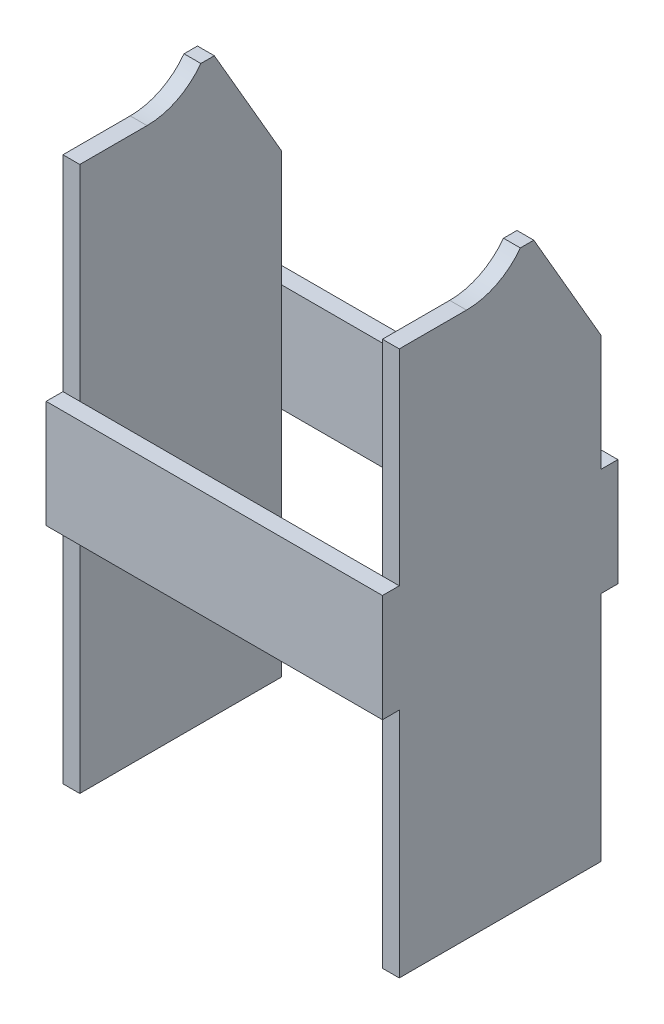
ISO-10303-21;
HEADER;
FILE_DESCRIPTION(('STEP AP214'),'2;1');
FILE_NAME('part.step','',(''),(''),'','','');
FILE_SCHEMA(('AUTOMOTIVE_DESIGN { 1 0 10303 214 1 1 1 1 }'));
ENDSEC;
DATA;
#1=APPLICATION_CONTEXT('core data for automotive mechanical design processes');
#2=APPLICATION_PROTOCOL_DEFINITION('international standard','automotive_design',2000,#1);
#3=PRODUCT_CONTEXT('',#1,'mechanical');
#4=PRODUCT('Part','Part','',(#3));
#5=PRODUCT_RELATED_PRODUCT_CATEGORY('part','',(#4));
#6=PRODUCT_DEFINITION_FORMATION('','',#4);
#7=PRODUCT_DEFINITION_CONTEXT('part definition',#1,'design');
#8=PRODUCT_DEFINITION('design','',#6,#7);
#9=PRODUCT_DEFINITION_SHAPE('','',#8);
#10=(LENGTH_UNIT() NAMED_UNIT(*) SI_UNIT(.MILLI.,.METRE.));
#11=(NAMED_UNIT(*) PLANE_ANGLE_UNIT() SI_UNIT($,.RADIAN.));
#12=(NAMED_UNIT(*) SI_UNIT($,.STERADIAN.) SOLID_ANGLE_UNIT());
#13=UNCERTAINTY_MEASURE_WITH_UNIT(LENGTH_MEASURE(1.E-05),#10,'distance_accuracy_value','');
#14=(GEOMETRIC_REPRESENTATION_CONTEXT(3) GLOBAL_UNCERTAINTY_ASSIGNED_CONTEXT((#13)) GLOBAL_UNIT_ASSIGNED_CONTEXT((#10,
#11,#12)) REPRESENTATION_CONTEXT('',''));
#15=CARTESIAN_POINT('',(0.,0.,0.));
#16=DIRECTION('',(0.,0.,1.));
#17=DIRECTION('',(1.,0.,0.));
#18=AXIS2_PLACEMENT_3D('',#15,#16,#17);
#19=CARTESIAN_POINT('',(-50.,170.,-30.));
#20=DIRECTION('',(0.,0.,1.));
#21=DIRECTION('',(1.,0.,0.));
#22=AXIS2_PLACEMENT_3D('',#19,#20,#21);
#23=PLANE('',#22);
#24=DIRECTION('',(0.,-1.,0.));
#25=VECTOR('',#24,1.);
#26=CARTESIAN_POINT('',(-50.,170.,-30.));
#27=LINE('',#26,#25);
#28=CARTESIAN_POINT('',(-50.,135.5,-30.));
#29=VERTEX_POINT('',#28);
#30=CARTESIAN_POINT('',(-50.,101.,-30.));
#31=VERTEX_POINT('',#30);
#32=EDGE_CURVE('E440',#29,#31,#27,.T.);
#33=ORIENTED_EDGE('',*,*,#32,.F.);
#34=DIRECTION('',(-1.,0.,0.));
#35=VECTOR('',#34,1.);
#36=CARTESIAN_POINT('',(70.,135.5,-30.));
#37=LINE('',#36,#35);
#38=CARTESIAN_POINT('',(-45.,135.5,-30.));
#39=VERTEX_POINT('',#38);
#40=EDGE_CURVE('E243',#39,#29,#37,.T.);
#41=ORIENTED_EDGE('',*,*,#40,.F.);
#42=DIRECTION('',(0.,-1.,0.));
#43=VECTOR('',#42,1.);
#44=CARTESIAN_POINT('',(-45.,170.,-30.));
#45=LINE('',#44,#43);
#46=CARTESIAN_POINT('',(-45.,101.,-30.));
#47=VERTEX_POINT('',#46);
#48=EDGE_CURVE('E444',#39,#47,#45,.T.);
#49=ORIENTED_EDGE('',*,*,#48,.T.);
#50=DIRECTION('',(1.,0.,0.));
#51=VECTOR('',#50,1.);
#52=CARTESIAN_POINT('',(-50.,101.,-30.));
#53=LINE('',#52,#51);
#54=EDGE_CURVE('E309',#31,#47,#53,.T.);
#55=ORIENTED_EDGE('',*,*,#54,.F.);
#56=EDGE_LOOP('',(#33,#41,#49,#55));
#57=FACE_BOUND('',#56,.T.);
#58=ADVANCED_FACE('F39',(#57),#23,.F.);
#59=CARTESIAN_POINT('',(45.,170.,-30.));
#60=DIRECTION('',(0.,0.,1.));
#61=DIRECTION('',(1.,0.,0.));
#62=AXIS2_PLACEMENT_3D('',#59,#60,#61);
#63=PLANE('',#62);
#64=DIRECTION('',(0.,-1.,0.));
#65=VECTOR('',#64,1.);
#66=CARTESIAN_POINT('',(45.,170.,-30.));
#67=LINE('',#66,#65);
#68=CARTESIAN_POINT('',(45.,135.5,-30.));
#69=VERTEX_POINT('',#68);
#70=CARTESIAN_POINT('',(45.,101.,-30.));
#71=VERTEX_POINT('',#70);
#72=EDGE_CURVE('E352',#69,#71,#67,.T.);
#73=ORIENTED_EDGE('',*,*,#72,.F.);
#74=CARTESIAN_POINT('',(50.,135.5,-30.));
#75=VERTEX_POINT('',#74);
#76=EDGE_CURVE('E248',#75,#69,#37,.T.);
#77=ORIENTED_EDGE('',*,*,#76,.F.);
#78=DIRECTION('',(0.,-1.,0.));
#79=VECTOR('',#78,1.);
#80=CARTESIAN_POINT('',(50.,170.,-30.));
#81=LINE('',#80,#79);
#82=CARTESIAN_POINT('',(50.,101.,-30.));
#83=VERTEX_POINT('',#82);
#84=EDGE_CURVE('E357',#75,#83,#81,.T.);
#85=ORIENTED_EDGE('',*,*,#84,.T.);
#86=EDGE_CURVE('E315',#71,#83,#53,.T.);
#87=ORIENTED_EDGE('',*,*,#86,.F.);
#88=EDGE_LOOP('',(#73,#77,#85,#87));
#89=FACE_BOUND('',#88,.T.);
#90=ADVANCED_FACE('F475',(#89),#63,.F.);
#91=CARTESIAN_POINT('',(-50.,101.,30.));
#92=DIRECTION('',(0.,0.,-1.));
#93=DIRECTION('',(-1.,0.,0.));
#94=AXIS2_PLACEMENT_3D('',#91,#92,#93);
#95=PLANE('',#94);
#96=DIRECTION('',(1.,0.,0.));
#97=VECTOR('',#96,1.);
#98=CARTESIAN_POINT('',(-50.,101.,30.));
#99=LINE('',#98,#97);
#100=CARTESIAN_POINT('',(-45.,101.,30.));
#101=VERTEX_POINT('',#100);
#102=CARTESIAN_POINT('',(45.,101.,30.));
#103=VERTEX_POINT('',#102);
#104=EDGE_CURVE('E390',#101,#103,#99,.T.);
#105=ORIENTED_EDGE('',*,*,#104,.T.);
#106=DIRECTION('',(0.,-1.,0.));
#107=VECTOR('',#106,1.);
#108=CARTESIAN_POINT('',(45.,170.,30.));
#109=LINE('',#108,#107);
#110=CARTESIAN_POINT('',(45.,69.,30.));
#111=VERTEX_POINT('',#110);
#112=EDGE_CURVE('E369',#103,#111,#109,.T.);
#113=ORIENTED_EDGE('',*,*,#112,.T.);
#114=DIRECTION('',(1.,0.,0.));
#115=VECTOR('',#114,1.);
#116=CARTESIAN_POINT('',(-50.,69.,30.));
#117=LINE('',#116,#115);
#118=CARTESIAN_POINT('',(-45.,69.,30.));
#119=VERTEX_POINT('',#118);
#120=EDGE_CURVE('E406',#119,#111,#117,.T.);
#121=ORIENTED_EDGE('',*,*,#120,.F.);
#122=DIRECTION('',(0.,-1.,0.));
#123=VECTOR('',#122,1.);
#124=CARTESIAN_POINT('',(-45.,170.,30.));
#125=LINE('',#124,#123);
#126=EDGE_CURVE('E452',#101,#119,#125,.T.);
#127=ORIENTED_EDGE('',*,*,#126,.F.);
#128=EDGE_LOOP('',(#105,#113,#121,#127));
#129=FACE_BOUND('',#128,.T.);
#130=ADVANCED_FACE('F542',(#129),#95,.T.);
#131=CARTESIAN_POINT('',(-50.,170.,30.));
#132=DIRECTION('',(0.,0.,-1.));
#133=DIRECTION('',(-1.,0.,0.));
#134=AXIS2_PLACEMENT_3D('',#131,#132,#133);
#135=PLANE('',#134);
#136=CARTESIAN_POINT('',(-50.,69.,30.));
#137=VERTEX_POINT('',#136);
#138=EDGE_CURVE('E401',#137,#119,#117,.T.);
#139=ORIENTED_EDGE('',*,*,#138,.F.);
#140=DIRECTION('',(0.,-1.,0.));
#141=VECTOR('',#140,1.);
#142=CARTESIAN_POINT('',(-50.,170.,30.));
#143=LINE('',#142,#141);
#144=CARTESIAN_POINT('',(-50.,0.,30.));
#145=VERTEX_POINT('',#144);
#146=EDGE_CURVE('E451',#137,#145,#143,.T.);
#147=ORIENTED_EDGE('',*,*,#146,.T.);
#148=DIRECTION('',(1.,0.,0.));
#149=VECTOR('',#148,1.);
#150=CARTESIAN_POINT('',(-50.,0.,30.));
#151=LINE('',#150,#149);
#152=CARTESIAN_POINT('',(-45.,0.,30.));
#153=VERTEX_POINT('',#152);
#154=EDGE_CURVE('E429',#145,#153,#151,.T.);
#155=ORIENTED_EDGE('',*,*,#154,.T.);
#156=EDGE_CURVE('E447',#119,#153,#125,.T.);
#157=ORIENTED_EDGE('',*,*,#156,.F.);
#158=EDGE_LOOP('',(#139,#147,#155,#157));
#159=FACE_BOUND('',#158,.T.);
#160=ADVANCED_FACE('F550',(#159),#135,.F.);
#161=CARTESIAN_POINT('',(-50.,170.,-30.));
#162=DIRECTION('',(1.,0.,0.));
#163=DIRECTION('',(0.,0.,-1.));
#164=AXIS2_PLACEMENT_3D('',#161,#162,#163);
#165=PLANE('',#164);
#166=DIRECTION('',(0.,0.,1.));
#167=VECTOR('',#166,1.);
#168=CARTESIAN_POINT('',(-50.,162.,10.));
#169=LINE('',#168,#167);
#170=CARTESIAN_POINT('',(-50.,162.,10.));
#171=VERTEX_POINT('',#170);
#172=CARTESIAN_POINT('',(-50.,162.,30.));
#173=VERTEX_POINT('',#172);
#174=EDGE_CURVE('E215',#171,#173,#169,.T.);
#175=ORIENTED_EDGE('',*,*,#174,.F.);
#176=CARTESIAN_POINT('',(-50.,182.,10.));
#177=DIRECTION('',(-1.,0.,0.));
#178=DIRECTION('',(0.,0.,1.));
#179=AXIS2_PLACEMENT_3D('',#176,#177,#178);
#180=CIRCLE('',#179,20.);
#181=CARTESIAN_POINT('',(-50.,170.,-5.99999999999996));
#182=VERTEX_POINT('',#181);
#183=EDGE_CURVE('E223',#182,#171,#180,.T.);
#184=ORIENTED_EDGE('',*,*,#183,.F.);
#185=DIRECTION('',(0.,0.,1.));
#186=VECTOR('',#185,1.);
#187=CARTESIAN_POINT('',(-50.,170.,-30.));
#188=LINE('',#187,#186);
#189=CARTESIAN_POINT('',(-50.,170.,-9.99999999999997));
#190=VERTEX_POINT('',#189);
#191=EDGE_CURVE('E417',#190,#182,#188,.T.);
#192=ORIENTED_EDGE('',*,*,#191,.F.);
#193=DIRECTION('',(0.,0.865140001465014,0.501530435631892));
#194=VECTOR('',#193,1.);
#195=CARTESIAN_POINT('',(-50.,170.,-9.99999999999997));
#196=LINE('',#195,#194);
#197=EDGE_CURVE('E63',#29,#190,#196,.T.);
#198=ORIENTED_EDGE('',*,*,#197,.F.);
#199=ORIENTED_EDGE('',*,*,#32,.T.);
#200=DIRECTION('',(0.,0.,1.));
#201=VECTOR('',#200,1.);
#202=CARTESIAN_POINT('',(-50.,101.,-30.));
#203=LINE('',#202,#201);
#204=CARTESIAN_POINT('',(-50.,101.,-35.));
#205=VERTEX_POINT('',#204);
#206=EDGE_CURVE('E294',#205,#31,#203,.T.);
#207=ORIENTED_EDGE('',*,*,#206,.F.);
#208=DIRECTION('',(0.,1.,0.));
#209=VECTOR('',#208,1.);
#210=CARTESIAN_POINT('',(-50.,101.,-35.));
#211=LINE('',#210,#209);
#212=CARTESIAN_POINT('',(-50.,69.,-35.));
#213=VERTEX_POINT('',#212);
#214=EDGE_CURVE('E289',#213,#205,#211,.T.);
#215=ORIENTED_EDGE('',*,*,#214,.F.);
#216=DIRECTION('',(0.,0.,-1.));
#217=VECTOR('',#216,1.);
#218=CARTESIAN_POINT('',(-50.,69.,-30.));
#219=LINE('',#218,#217);
#220=CARTESIAN_POINT('',(-50.,69.,-30.));
#221=VERTEX_POINT('',#220);
#222=EDGE_CURVE('E285',#221,#213,#219,.T.);
#223=ORIENTED_EDGE('',*,*,#222,.F.);
#224=CARTESIAN_POINT('',(-50.,0.,-30.));
#225=VERTEX_POINT('',#224);
#226=EDGE_CURVE('E425',#221,#225,#27,.T.);
#227=ORIENTED_EDGE('',*,*,#226,.T.);
#228=DIRECTION('',(0.,0.,1.));
#229=VECTOR('',#228,1.);
#230=CARTESIAN_POINT('',(-50.,0.,-30.));
#231=LINE('',#230,#229);
#232=EDGE_CURVE('E405',#225,#145,#231,.T.);
#233=ORIENTED_EDGE('',*,*,#232,.T.);
#234=ORIENTED_EDGE('',*,*,#146,.F.);
#235=DIRECTION('',(0.,0.,-1.));
#236=VECTOR('',#235,1.);
#237=CARTESIAN_POINT('',(-50.,69.,30.));
#238=LINE('',#237,#236);
#239=CARTESIAN_POINT('',(-50.,69.,35.));
#240=VERTEX_POINT('',#239);
#241=EDGE_CURVE('E387',#240,#137,#238,.T.);
#242=ORIENTED_EDGE('',*,*,#241,.F.);
#243=DIRECTION('',(0.,-1.,0.));
#244=VECTOR('',#243,1.);
#245=CARTESIAN_POINT('',(-50.,101.,35.));
#246=LINE('',#245,#244);
#247=CARTESIAN_POINT('',(-50.,101.,35.));
#248=VERTEX_POINT('',#247);
#249=EDGE_CURVE('E382',#248,#240,#246,.T.);
#250=ORIENTED_EDGE('',*,*,#249,.F.);
#251=DIRECTION('',(0.,0.,1.));
#252=VECTOR('',#251,1.);
#253=CARTESIAN_POINT('',(-50.,101.,30.));
#254=LINE('',#253,#252);
#255=CARTESIAN_POINT('',(-50.,101.,30.));
#256=VERTEX_POINT('',#255);
#257=EDGE_CURVE('E378',#256,#248,#254,.T.);
#258=ORIENTED_EDGE('',*,*,#257,.F.);
#259=EDGE_CURVE('E233',#173,#256,#143,.T.);
#260=ORIENTED_EDGE('',*,*,#259,.F.);
#261=EDGE_LOOP('',(#175,#184,#192,#198,#199,#207,#215,#223,#227,#233,#234,#242,#250,#258,#260));
#262=FACE_BOUND('',#261,.T.);
#263=ADVANCED_FACE('F41',(#262),#165,.F.);
#264=CARTESIAN_POINT('',(-45.,162.,30.));
#265=VERTEX_POINT('',#264);
#266=EDGE_CURVE('E448',#265,#101,#125,.T.);
#267=ORIENTED_EDGE('',*,*,#266,.F.);
#268=DIRECTION('',(-1.,0.,0.));
#269=VECTOR('',#268,1.);
#270=CARTESIAN_POINT('',(70.,162.,30.));
#271=LINE('',#270,#269);
#272=EDGE_CURVE('E237',#265,#173,#271,.T.);
#273=ORIENTED_EDGE('',*,*,#272,.T.);
#274=ORIENTED_EDGE('',*,*,#259,.T.);
#275=EDGE_CURVE('E413',#256,#101,#99,.T.);
#276=ORIENTED_EDGE('',*,*,#275,.T.);
#277=EDGE_LOOP('',(#267,#273,#274,#276));
#278=FACE_BOUND('',#277,.T.);
#279=ADVANCED_FACE('F557',(#278),#135,.F.);
#280=CARTESIAN_POINT('',(-45.,170.,-30.));
#281=DIRECTION('',(-1.,0.,0.));
#282=DIRECTION('',(0.,0.,1.));
#283=AXIS2_PLACEMENT_3D('',#280,#281,#282);
#284=PLANE('',#283);
#285=DIRECTION('',(0.,0.,-1.));
#286=VECTOR('',#285,1.);
#287=CARTESIAN_POINT('',(-45.,170.,-30.));
#288=LINE('',#287,#286);
#289=CARTESIAN_POINT('',(-45.,170.,-5.99999999999996));
#290=VERTEX_POINT('',#289);
#291=CARTESIAN_POINT('',(-45.,170.,-9.99999999999997));
#292=VERTEX_POINT('',#291);
#293=EDGE_CURVE('E420',#290,#292,#288,.T.);
#294=ORIENTED_EDGE('',*,*,#293,.F.);
#295=CARTESIAN_POINT('',(-45.,182.,10.));
#296=DIRECTION('',(-1.,0.,0.));
#297=DIRECTION('',(0.,0.,1.));
#298=AXIS2_PLACEMENT_3D('',#295,#296,#297);
#299=CIRCLE('',#298,20.);
#300=CARTESIAN_POINT('',(-45.,162.,10.));
#301=VERTEX_POINT('',#300);
#302=EDGE_CURVE('E55',#290,#301,#299,.T.);
#303=ORIENTED_EDGE('',*,*,#302,.T.);
#304=DIRECTION('',(0.,0.,1.));
#305=VECTOR('',#304,1.);
#306=CARTESIAN_POINT('',(-45.,162.,-30.));
#307=LINE('',#306,#305);
#308=EDGE_CURVE('E218',#301,#265,#307,.T.);
#309=ORIENTED_EDGE('',*,*,#308,.T.);
#310=ORIENTED_EDGE('',*,*,#266,.T.);
#311=ORIENTED_EDGE('',*,*,#126,.T.);
#312=ORIENTED_EDGE('',*,*,#156,.T.);
#313=DIRECTION('',(0.,0.,-1.));
#314=VECTOR('',#313,1.);
#315=CARTESIAN_POINT('',(-45.,0.,-30.));
#316=LINE('',#315,#314);
#317=CARTESIAN_POINT('',(-45.,0.,-30.));
#318=VERTEX_POINT('',#317);
#319=EDGE_CURVE('E433',#153,#318,#316,.T.);
#320=ORIENTED_EDGE('',*,*,#319,.T.);
#321=CARTESIAN_POINT('',(-45.,69.,-30.));
#322=VERTEX_POINT('',#321);
#323=EDGE_CURVE('E443',#322,#318,#45,.T.);
#324=ORIENTED_EDGE('',*,*,#323,.F.);
#325=EDGE_CURVE('E313',#47,#322,#45,.T.);
#326=ORIENTED_EDGE('',*,*,#325,.F.);
#327=ORIENTED_EDGE('',*,*,#48,.F.);
#328=DIRECTION('',(0.,0.865140001465014,0.501530435631893));
#329=VECTOR('',#328,1.);
#330=CARTESIAN_POINT('',(-45.,161.322119163654,-15.0306555573023));
#331=LINE('',#330,#329);
#332=EDGE_CURVE('E258',#39,#292,#331,.T.);
#333=ORIENTED_EDGE('',*,*,#332,.T.);
#334=EDGE_LOOP('',(#294,#303,#309,#310,#311,#312,#320,#324,#326,#327,#333));
#335=FACE_BOUND('',#334,.T.);
#336=ADVANCED_FACE('F493',(#335),#284,.F.);
#337=ORIENTED_EDGE('',*,*,#226,.F.);
#338=DIRECTION('',(1.,0.,0.));
#339=VECTOR('',#338,1.);
#340=CARTESIAN_POINT('',(-50.,69.,-30.));
#341=LINE('',#340,#339);
#342=EDGE_CURVE('E322',#221,#322,#341,.T.);
#343=ORIENTED_EDGE('',*,*,#342,.T.);
#344=ORIENTED_EDGE('',*,*,#323,.T.);
#345=DIRECTION('',(-1.,0.,0.));
#346=VECTOR('',#345,1.);
#347=CARTESIAN_POINT('',(-50.,0.,-30.));
#348=LINE('',#347,#346);
#349=EDGE_CURVE('E421',#318,#225,#348,.T.);
#350=ORIENTED_EDGE('',*,*,#349,.T.);
#351=EDGE_LOOP('',(#337,#343,#344,#350));
#352=FACE_BOUND('',#351,.T.);
#353=ADVANCED_FACE('F500',(#352),#23,.F.);
#354=CARTESIAN_POINT('',(0.,170.,0.));
#355=DIRECTION('',(0.,1.,0.));
#356=DIRECTION('',(0.,0.,1.));
#357=AXIS2_PLACEMENT_3D('',#354,#355,#356);
#358=PLANE('',#357);
#359=DIRECTION('',(-1.,0.,0.));
#360=VECTOR('',#359,1.);
#361=CARTESIAN_POINT('',(70.,170.,-5.99999999999999));
#362=LINE('',#361,#360);
#363=EDGE_CURVE('E225',#290,#182,#362,.T.);
#364=ORIENTED_EDGE('',*,*,#363,.F.);
#365=ORIENTED_EDGE('',*,*,#293,.T.);
#366=DIRECTION('',(-1.,0.,0.));
#367=VECTOR('',#366,1.);
#368=CARTESIAN_POINT('',(70.,170.,-10.));
#369=LINE('',#368,#367);
#370=EDGE_CURVE('E244',#292,#190,#369,.T.);
#371=ORIENTED_EDGE('',*,*,#370,.T.);
#372=ORIENTED_EDGE('',*,*,#191,.T.);
#373=EDGE_LOOP('',(#364,#365,#371,#372));
#374=FACE_BOUND('',#373,.T.);
#375=ADVANCED_FACE('F604',(#374),#358,.T.);
#376=CARTESIAN_POINT('',(0.,0.,0.));
#377=DIRECTION('',(0.,1.,0.));
#378=DIRECTION('',(0.,0.,1.));
#379=AXIS2_PLACEMENT_3D('',#376,#377,#378);
#380=PLANE('',#379);
#381=ORIENTED_EDGE('',*,*,#232,.F.);
#382=ORIENTED_EDGE('',*,*,#349,.F.);
#383=ORIENTED_EDGE('',*,*,#319,.F.);
#384=ORIENTED_EDGE('',*,*,#154,.F.);
#385=EDGE_LOOP('',(#381,#382,#383,#384));
#386=FACE_BOUND('',#385,.T.);
#387=ADVANCED_FACE('F508',(#386),#380,.F.);
#388=CARTESIAN_POINT('',(-50.,69.,30.));
#389=DIRECTION('',(0.,-1.,0.));
#390=DIRECTION('',(0.,0.,-1.));
#391=AXIS2_PLACEMENT_3D('',#388,#389,#390);
#392=PLANE('',#391);
#393=DIRECTION('',(0.,0.,-1.));
#394=VECTOR('',#393,1.);
#395=CARTESIAN_POINT('',(50.,69.,30.));
#396=LINE('',#395,#394);
#397=CARTESIAN_POINT('',(50.,69.,35.));
#398=VERTEX_POINT('',#397);
#399=CARTESIAN_POINT('',(50.,69.,30.));
#400=VERTEX_POINT('',#399);
#401=EDGE_CURVE('E383',#398,#400,#396,.T.);
#402=ORIENTED_EDGE('',*,*,#401,.F.);
#403=DIRECTION('',(1.,0.,0.));
#404=VECTOR('',#403,1.);
#405=CARTESIAN_POINT('',(-50.,69.,35.));
#406=LINE('',#405,#404);
#407=EDGE_CURVE('E407',#240,#398,#406,.T.);
#408=ORIENTED_EDGE('',*,*,#407,.F.);
#409=ORIENTED_EDGE('',*,*,#241,.T.);
#410=ORIENTED_EDGE('',*,*,#138,.T.);
#411=ORIENTED_EDGE('',*,*,#120,.T.);
#412=DIRECTION('',(1.,0.,0.));
#413=VECTOR('',#412,1.);
#414=CARTESIAN_POINT('',(-50.,69.,30.));
#415=LINE('',#414,#413);
#416=EDGE_CURVE('E373',#111,#400,#415,.T.);
#417=ORIENTED_EDGE('',*,*,#416,.T.);
#418=EDGE_LOOP('',(#402,#408,#409,#410,#411,#417));
#419=FACE_BOUND('',#418,.T.);
#420=ADVANCED_FACE('F547',(#419),#392,.T.);
#421=CARTESIAN_POINT('',(-50.,101.,35.));
#422=DIRECTION('',(0.,0.,1.));
#423=DIRECTION('',(0.,-1.,0.));
#424=AXIS2_PLACEMENT_3D('',#421,#422,#423);
#425=PLANE('',#424);
#426=DIRECTION('',(0.,-1.,0.));
#427=VECTOR('',#426,1.);
#428=CARTESIAN_POINT('',(50.,101.,35.));
#429=LINE('',#428,#427);
#430=CARTESIAN_POINT('',(50.,101.,35.));
#431=VERTEX_POINT('',#430);
#432=EDGE_CURVE('E394',#431,#398,#429,.T.);
#433=ORIENTED_EDGE('',*,*,#432,.F.);
#434=DIRECTION('',(1.,0.,0.));
#435=VECTOR('',#434,1.);
#436=CARTESIAN_POINT('',(-50.,101.,35.));
#437=LINE('',#436,#435);
#438=EDGE_CURVE('E410',#248,#431,#437,.T.);
#439=ORIENTED_EDGE('',*,*,#438,.F.);
#440=ORIENTED_EDGE('',*,*,#249,.T.);
#441=ORIENTED_EDGE('',*,*,#407,.T.);
#442=EDGE_LOOP('',(#433,#439,#440,#441));
#443=FACE_BOUND('',#442,.T.);
#444=ADVANCED_FACE('F564',(#443),#425,.T.);
#445=CARTESIAN_POINT('',(-50.,101.,30.));
#446=DIRECTION('',(0.,1.,0.));
#447=DIRECTION('',(0.,0.,1.));
#448=AXIS2_PLACEMENT_3D('',#445,#446,#447);
#449=PLANE('',#448);
#450=DIRECTION('',(0.,0.,1.));
#451=VECTOR('',#450,1.);
#452=CARTESIAN_POINT('',(50.,101.,30.));
#453=LINE('',#452,#451);
#454=CARTESIAN_POINT('',(50.,101.,30.));
#455=VERTEX_POINT('',#454);
#456=EDGE_CURVE('E377',#455,#431,#453,.T.);
#457=ORIENTED_EDGE('',*,*,#456,.F.);
#458=DIRECTION('',(-1.,0.,0.));
#459=VECTOR('',#458,1.);
#460=CARTESIAN_POINT('',(-50.,101.,30.));
#461=LINE('',#460,#459);
#462=EDGE_CURVE('E368',#455,#103,#461,.T.);
#463=ORIENTED_EDGE('',*,*,#462,.T.);
#464=ORIENTED_EDGE('',*,*,#104,.F.);
#465=ORIENTED_EDGE('',*,*,#275,.F.);
#466=ORIENTED_EDGE('',*,*,#257,.T.);
#467=ORIENTED_EDGE('',*,*,#438,.T.);
#468=EDGE_LOOP('',(#457,#463,#464,#465,#466,#467));
#469=FACE_BOUND('',#468,.T.);
#470=ADVANCED_FACE('F560',(#469),#449,.T.);
#471=CARTESIAN_POINT('',(50.,0.,0.));
#472=DIRECTION('',(-1.,0.,0.));
#473=DIRECTION('',(0.,0.,1.));
#474=AXIS2_PLACEMENT_3D('',#471,#472,#473);
#475=PLANE('',#474);
#476=DIRECTION('',(0.,0.,-1.));
#477=VECTOR('',#476,1.);
#478=CARTESIAN_POINT('',(50.,170.,-30.));
#479=LINE('',#478,#477);
#480=CARTESIAN_POINT('',(50.,170.,-5.99999999999998));
#481=VERTEX_POINT('',#480);
#482=CARTESIAN_POINT('',(50.,170.,-9.99999999999999));
#483=VERTEX_POINT('',#482);
#484=EDGE_CURVE('E331',#481,#483,#479,.T.);
#485=ORIENTED_EDGE('',*,*,#484,.F.);
#486=CARTESIAN_POINT('',(50.,182.,9.99999999999999));
#487=DIRECTION('',(-1.,0.,0.));
#488=DIRECTION('',(0.,0.,1.));
#489=AXIS2_PLACEMENT_3D('',#486,#487,#488);
#490=CIRCLE('',#489,20.);
#491=CARTESIAN_POINT('',(50.,162.,9.99999999999999));
#492=VERTEX_POINT('',#491);
#493=EDGE_CURVE('E266',#481,#492,#490,.T.);
#494=ORIENTED_EDGE('',*,*,#493,.T.);
#495=DIRECTION('',(0.,0.,1.));
#496=VECTOR('',#495,1.);
#497=CARTESIAN_POINT('',(50.,162.,0.));
#498=LINE('',#497,#496);
#499=CARTESIAN_POINT('',(50.,162.,30.));
#500=VERTEX_POINT('',#499);
#501=EDGE_CURVE('E278',#492,#500,#498,.T.);
#502=ORIENTED_EDGE('',*,*,#501,.T.);
#503=DIRECTION('',(0.,-1.,0.));
#504=VECTOR('',#503,1.);
#505=CARTESIAN_POINT('',(50.,170.,30.));
#506=LINE('',#505,#504);
#507=EDGE_CURVE('E361',#500,#455,#506,.T.);
#508=ORIENTED_EDGE('',*,*,#507,.T.);
#509=ORIENTED_EDGE('',*,*,#456,.T.);
#510=ORIENTED_EDGE('',*,*,#432,.T.);
#511=ORIENTED_EDGE('',*,*,#401,.T.);
#512=CARTESIAN_POINT('',(50.,0.,30.));
#513=VERTEX_POINT('',#512);
#514=EDGE_CURVE('E360',#400,#513,#506,.T.);
#515=ORIENTED_EDGE('',*,*,#514,.T.);
#516=DIRECTION('',(0.,0.,-1.));
#517=VECTOR('',#516,1.);
#518=CARTESIAN_POINT('',(50.,0.,-30.));
#519=LINE('',#518,#517);
#520=CARTESIAN_POINT('',(50.,0.,-30.));
#521=VERTEX_POINT('',#520);
#522=EDGE_CURVE('E345',#513,#521,#519,.T.);
#523=ORIENTED_EDGE('',*,*,#522,.T.);
#524=CARTESIAN_POINT('',(50.,69.,-30.));
#525=VERTEX_POINT('',#524);
#526=EDGE_CURVE('E355',#525,#521,#81,.T.);
#527=ORIENTED_EDGE('',*,*,#526,.F.);
#528=DIRECTION('',(0.,0.,-1.));
#529=VECTOR('',#528,1.);
#530=CARTESIAN_POINT('',(50.,69.,-30.));
#531=LINE('',#530,#529);
#532=CARTESIAN_POINT('',(50.,69.,-35.));
#533=VERTEX_POINT('',#532);
#534=EDGE_CURVE('E284',#525,#533,#531,.T.);
#535=ORIENTED_EDGE('',*,*,#534,.T.);
#536=DIRECTION('',(0.,1.,0.));
#537=VECTOR('',#536,1.);
#538=CARTESIAN_POINT('',(50.,101.,-35.));
#539=LINE('',#538,#537);
#540=CARTESIAN_POINT('',(50.,101.,-35.));
#541=VERTEX_POINT('',#540);
#542=EDGE_CURVE('E302',#533,#541,#539,.T.);
#543=ORIENTED_EDGE('',*,*,#542,.T.);
#544=DIRECTION('',(0.,0.,1.));
#545=VECTOR('',#544,1.);
#546=CARTESIAN_POINT('',(50.,101.,-30.));
#547=LINE('',#546,#545);
#548=EDGE_CURVE('E290',#541,#83,#547,.T.);
#549=ORIENTED_EDGE('',*,*,#548,.T.);
#550=ORIENTED_EDGE('',*,*,#84,.F.);
#551=DIRECTION('',(0.,0.865140001465014,0.501530435631893));
#552=VECTOR('',#551,1.);
#553=CARTESIAN_POINT('',(50.,47.0995126552429,-81.246659330294));
#554=LINE('',#553,#552);
#555=EDGE_CURVE('E254',#75,#483,#554,.T.);
#556=ORIENTED_EDGE('',*,*,#555,.T.);
#557=EDGE_LOOP('',(#485,#494,#502,#508,#509,#510,#511,#515,#523,#527,#535,#543,#549,#550,#556));
#558=FACE_BOUND('',#557,.T.);
#559=ADVANCED_FACE('F480',(#558),#475,.F.);
#560=CARTESIAN_POINT('',(45.,170.,30.));
#561=DIRECTION('',(0.,0.,-1.));
#562=DIRECTION('',(-1.,0.,0.));
#563=AXIS2_PLACEMENT_3D('',#560,#561,#562);
#564=PLANE('',#563);
#565=ORIENTED_EDGE('',*,*,#416,.F.);
#566=CARTESIAN_POINT('',(45.,0.,30.));
#567=VERTEX_POINT('',#566);
#568=EDGE_CURVE('E364',#111,#567,#109,.T.);
#569=ORIENTED_EDGE('',*,*,#568,.T.);
#570=DIRECTION('',(1.,0.,0.));
#571=VECTOR('',#570,1.);
#572=CARTESIAN_POINT('',(45.,0.,30.));
#573=LINE('',#572,#571);
#574=EDGE_CURVE('E341',#567,#513,#573,.T.);
#575=ORIENTED_EDGE('',*,*,#574,.T.);
#576=ORIENTED_EDGE('',*,*,#514,.F.);
#577=EDGE_LOOP('',(#565,#569,#575,#576));
#578=FACE_BOUND('',#577,.T.);
#579=ADVANCED_FACE('F538',(#578),#564,.F.);
#580=CARTESIAN_POINT('',(45.,170.,-30.));
#581=DIRECTION('',(1.,0.,0.));
#582=DIRECTION('',(0.,0.,-1.));
#583=AXIS2_PLACEMENT_3D('',#580,#581,#582);
#584=PLANE('',#583);
#585=DIRECTION('',(0.,0.,-1.));
#586=VECTOR('',#585,1.);
#587=CARTESIAN_POINT('',(45.,162.,-30.));
#588=LINE('',#587,#586);
#589=CARTESIAN_POINT('',(45.,162.,30.));
#590=VERTEX_POINT('',#589);
#591=CARTESIAN_POINT('',(45.,162.,9.99999999999999));
#592=VERTEX_POINT('',#591);
#593=EDGE_CURVE('E274',#590,#592,#588,.T.);
#594=ORIENTED_EDGE('',*,*,#593,.T.);
#595=CARTESIAN_POINT('',(45.,182.,9.99999999999999));
#596=DIRECTION('',(1.,0.,0.));
#597=DIRECTION('',(0.,0.,-1.));
#598=AXIS2_PLACEMENT_3D('',#595,#596,#597);
#599=CIRCLE('',#598,20.);
#600=CARTESIAN_POINT('',(45.,170.,-5.99999999999998));
#601=VERTEX_POINT('',#600);
#602=EDGE_CURVE('E262',#592,#601,#599,.T.);
#603=ORIENTED_EDGE('',*,*,#602,.T.);
#604=DIRECTION('',(0.,0.,1.));
#605=VECTOR('',#604,1.);
#606=CARTESIAN_POINT('',(45.,170.,-30.));
#607=LINE('',#606,#605);
#608=CARTESIAN_POINT('',(45.,170.,-9.99999999999999));
#609=VERTEX_POINT('',#608);
#610=EDGE_CURVE('E327',#609,#601,#607,.T.);
#611=ORIENTED_EDGE('',*,*,#610,.F.);
#612=DIRECTION('',(0.,-0.865140001465014,-0.501530435631893));
#613=VECTOR('',#612,1.);
#614=CARTESIAN_POINT('',(45.,161.322119163654,-15.0306555573023));
#615=LINE('',#614,#613);
#616=EDGE_CURVE('E247',#609,#69,#615,.T.);
#617=ORIENTED_EDGE('',*,*,#616,.T.);
#618=ORIENTED_EDGE('',*,*,#72,.T.);
#619=CARTESIAN_POINT('',(45.,69.,-30.));
#620=VERTEX_POINT('',#619);
#621=EDGE_CURVE('E356',#71,#620,#67,.T.);
#622=ORIENTED_EDGE('',*,*,#621,.T.);
#623=CARTESIAN_POINT('',(45.,0.,-30.));
#624=VERTEX_POINT('',#623);
#625=EDGE_CURVE('E336',#620,#624,#67,.T.);
#626=ORIENTED_EDGE('',*,*,#625,.T.);
#627=DIRECTION('',(0.,0.,1.));
#628=VECTOR('',#627,1.);
#629=CARTESIAN_POINT('',(45.,0.,-30.));
#630=LINE('',#629,#628);
#631=EDGE_CURVE('E337',#624,#567,#630,.T.);
#632=ORIENTED_EDGE('',*,*,#631,.T.);
#633=ORIENTED_EDGE('',*,*,#568,.F.);
#634=ORIENTED_EDGE('',*,*,#112,.F.);
#635=EDGE_CURVE('E365',#590,#103,#109,.T.);
#636=ORIENTED_EDGE('',*,*,#635,.F.);
#637=EDGE_LOOP('',(#594,#603,#611,#617,#618,#622,#626,#632,#633,#634,#636));
#638=FACE_BOUND('',#637,.T.);
#639=ADVANCED_FACE('F526',(#638),#584,.F.);
#640=ORIENTED_EDGE('',*,*,#507,.F.);
#641=EDGE_CURVE('E239',#500,#590,#271,.T.);
#642=ORIENTED_EDGE('',*,*,#641,.T.);
#643=ORIENTED_EDGE('',*,*,#635,.T.);
#644=ORIENTED_EDGE('',*,*,#462,.F.);
#645=EDGE_LOOP('',(#640,#642,#643,#644));
#646=FACE_BOUND('',#645,.T.);
#647=ADVANCED_FACE('F569',(#646),#564,.F.);
#648=ORIENTED_EDGE('',*,*,#625,.F.);
#649=EDGE_CURVE('E326',#620,#525,#341,.T.);
#650=ORIENTED_EDGE('',*,*,#649,.T.);
#651=ORIENTED_EDGE('',*,*,#526,.T.);
#652=DIRECTION('',(-1.,0.,0.));
#653=VECTOR('',#652,1.);
#654=CARTESIAN_POINT('',(45.,0.,-30.));
#655=LINE('',#654,#653);
#656=EDGE_CURVE('E332',#521,#624,#655,.T.);
#657=ORIENTED_EDGE('',*,*,#656,.T.);
#658=EDGE_LOOP('',(#648,#650,#651,#657));
#659=FACE_BOUND('',#658,.T.);
#660=ADVANCED_FACE('F531',(#659),#63,.F.);
#661=CARTESIAN_POINT('',(0.,170.,0.));
#662=DIRECTION('',(0.,1.,0.));
#663=DIRECTION('',(0.,0.,1.));
#664=AXIS2_PLACEMENT_3D('',#661,#662,#663);
#665=PLANE('',#664);
#666=DIRECTION('',(-1.,0.,0.));
#667=VECTOR('',#666,1.);
#668=CARTESIAN_POINT('',(70.,170.,-5.99999999999999));
#669=LINE('',#668,#667);
#670=EDGE_CURVE('E11',#481,#601,#669,.T.);
#671=ORIENTED_EDGE('',*,*,#670,.F.);
#672=ORIENTED_EDGE('',*,*,#484,.T.);
#673=DIRECTION('',(1.,0.,0.));
#674=VECTOR('',#673,1.);
#675=CARTESIAN_POINT('',(0.,170.,-9.99999999999998));
#676=LINE('',#675,#674);
#677=EDGE_CURVE('E48',#609,#483,#676,.T.);
#678=ORIENTED_EDGE('',*,*,#677,.F.);
#679=ORIENTED_EDGE('',*,*,#610,.T.);
#680=EDGE_LOOP('',(#671,#672,#678,#679));
#681=FACE_BOUND('',#680,.T.);
#682=ADVANCED_FACE('F642',(#681),#665,.T.);
#683=CARTESIAN_POINT('',(0.,0.,0.));
#684=DIRECTION('',(0.,1.,0.));
#685=DIRECTION('',(0.,0.,1.));
#686=AXIS2_PLACEMENT_3D('',#683,#684,#685);
#687=PLANE('',#686);
#688=ORIENTED_EDGE('',*,*,#631,.F.);
#689=ORIENTED_EDGE('',*,*,#656,.F.);
#690=ORIENTED_EDGE('',*,*,#522,.F.);
#691=ORIENTED_EDGE('',*,*,#574,.F.);
#692=EDGE_LOOP('',(#688,#689,#690,#691));
#693=FACE_BOUND('',#692,.T.);
#694=ADVANCED_FACE('F536',(#693),#687,.F.);
#695=CARTESIAN_POINT('',(-50.,101.,-30.));
#696=DIRECTION('',(0.,0.,1.));
#697=DIRECTION('',(1.,0.,0.));
#698=AXIS2_PLACEMENT_3D('',#695,#696,#697);
#699=PLANE('',#698);
#700=EDGE_CURVE('E314',#47,#71,#53,.T.);
#701=ORIENTED_EDGE('',*,*,#700,.F.);
#702=ORIENTED_EDGE('',*,*,#325,.T.);
#703=EDGE_CURVE('E298',#322,#620,#341,.T.);
#704=ORIENTED_EDGE('',*,*,#703,.T.);
#705=ORIENTED_EDGE('',*,*,#621,.F.);
#706=EDGE_LOOP('',(#701,#702,#704,#705));
#707=FACE_BOUND('',#706,.T.);
#708=ADVANCED_FACE('F580',(#707),#699,.T.);
#709=CARTESIAN_POINT('',(-50.,101.,-30.));
#710=DIRECTION('',(0.,1.,0.));
#711=DIRECTION('',(0.,0.,1.));
#712=AXIS2_PLACEMENT_3D('',#709,#710,#711);
#713=PLANE('',#712);
#714=ORIENTED_EDGE('',*,*,#548,.F.);
#715=DIRECTION('',(1.,0.,0.));
#716=VECTOR('',#715,1.);
#717=CARTESIAN_POINT('',(-50.,101.,-35.));
#718=LINE('',#717,#716);
#719=EDGE_CURVE('E316',#205,#541,#718,.T.);
#720=ORIENTED_EDGE('',*,*,#719,.F.);
#721=ORIENTED_EDGE('',*,*,#206,.T.);
#722=ORIENTED_EDGE('',*,*,#54,.T.);
#723=ORIENTED_EDGE('',*,*,#700,.T.);
#724=ORIENTED_EDGE('',*,*,#86,.T.);
#725=EDGE_LOOP('',(#714,#720,#721,#722,#723,#724));
#726=FACE_BOUND('',#725,.T.);
#727=ADVANCED_FACE('F467',(#726),#713,.T.);
#728=CARTESIAN_POINT('',(-50.,101.,-35.));
#729=DIRECTION('',(0.,0.,-1.));
#730=DIRECTION('',(0.,1.,0.));
#731=AXIS2_PLACEMENT_3D('',#728,#729,#730);
#732=PLANE('',#731);
#733=ORIENTED_EDGE('',*,*,#542,.F.);
#734=DIRECTION('',(1.,0.,0.));
#735=VECTOR('',#734,1.);
#736=CARTESIAN_POINT('',(-50.,69.,-35.));
#737=LINE('',#736,#735);
#738=EDGE_CURVE('E319',#213,#533,#737,.T.);
#739=ORIENTED_EDGE('',*,*,#738,.F.);
#740=ORIENTED_EDGE('',*,*,#214,.T.);
#741=ORIENTED_EDGE('',*,*,#719,.T.);
#742=EDGE_LOOP('',(#733,#739,#740,#741));
#743=FACE_BOUND('',#742,.T.);
#744=ADVANCED_FACE('F485',(#743),#732,.T.);
#745=CARTESIAN_POINT('',(-50.,69.,-30.));
#746=DIRECTION('',(0.,-1.,0.));
#747=DIRECTION('',(0.,0.,-1.));
#748=AXIS2_PLACEMENT_3D('',#745,#746,#747);
#749=PLANE('',#748);
#750=ORIENTED_EDGE('',*,*,#534,.F.);
#751=ORIENTED_EDGE('',*,*,#649,.F.);
#752=ORIENTED_EDGE('',*,*,#703,.F.);
#753=ORIENTED_EDGE('',*,*,#342,.F.);
#754=ORIENTED_EDGE('',*,*,#222,.T.);
#755=ORIENTED_EDGE('',*,*,#738,.T.);
#756=EDGE_LOOP('',(#750,#751,#752,#753,#754,#755));
#757=FACE_BOUND('',#756,.T.);
#758=ADVANCED_FACE('F582',(#757),#749,.T.);
#759=CARTESIAN_POINT('',(70.,170.,-10.));
#760=DIRECTION('',(0.,-0.501530435631892,0.865140001465014));
#761=DIRECTION('',(0.,-0.865140001465014,-0.501530435631893));
#762=AXIS2_PLACEMENT_3D('',#759,#760,#761);
#763=PLANE('',#762);
#764=ORIENTED_EDGE('',*,*,#76,.T.);
#765=ORIENTED_EDGE('',*,*,#616,.F.);
#766=ORIENTED_EDGE('',*,*,#677,.T.);
#767=ORIENTED_EDGE('',*,*,#555,.F.);
#768=EDGE_LOOP('',(#764,#765,#766,#767));
#769=FACE_BOUND('',#768,.T.);
#770=ADVANCED_FACE('F584',(#769),#763,.F.);
#771=CARTESIAN_POINT('',(70.,182.,9.99999999999999));
#772=DIRECTION('',(-1.,0.,0.));
#773=DIRECTION('',(0.,0.,1.));
#774=AXIS2_PLACEMENT_3D('',#771,#772,#773);
#775=CYLINDRICAL_SURFACE('',#774,20.);
#776=ORIENTED_EDGE('',*,*,#670,.T.);
#777=ORIENTED_EDGE('',*,*,#602,.F.);
#778=DIRECTION('',(-1.,0.,0.));
#779=VECTOR('',#778,1.);
#780=CARTESIAN_POINT('',(70.,162.,9.99999999999999));
#781=LINE('',#780,#779);
#782=EDGE_CURVE('E220',#492,#592,#781,.T.);
#783=ORIENTED_EDGE('',*,*,#782,.F.);
#784=ORIENTED_EDGE('',*,*,#493,.F.);
#785=EDGE_LOOP('',(#776,#777,#783,#784));
#786=FACE_BOUND('',#785,.T.);
#787=ADVANCED_FACE('F590',(#786),#775,.F.);
#788=CARTESIAN_POINT('',(70.,162.,9.99999999999999));
#789=DIRECTION('',(0.,-1.,0.));
#790=DIRECTION('',(0.,0.,-1.));
#791=AXIS2_PLACEMENT_3D('',#788,#789,#790);
#792=PLANE('',#791);
#793=ORIENTED_EDGE('',*,*,#782,.T.);
#794=ORIENTED_EDGE('',*,*,#593,.F.);
#795=ORIENTED_EDGE('',*,*,#641,.F.);
#796=ORIENTED_EDGE('',*,*,#501,.F.);
#797=EDGE_LOOP('',(#793,#794,#795,#796));
#798=FACE_BOUND('',#797,.T.);
#799=ADVANCED_FACE('F573',(#798),#792,.F.);
#800=ORIENTED_EDGE('',*,*,#40,.T.);
#801=ORIENTED_EDGE('',*,*,#197,.T.);
#802=ORIENTED_EDGE('',*,*,#370,.F.);
#803=ORIENTED_EDGE('',*,*,#332,.F.);
#804=EDGE_LOOP('',(#800,#801,#802,#803));
#805=FACE_BOUND('',#804,.T.);
#806=ADVANCED_FACE('F592',(#805),#763,.F.);
#807=EDGE_CURVE('E211',#301,#171,#781,.T.);
#808=ORIENTED_EDGE('',*,*,#807,.T.);
#809=ORIENTED_EDGE('',*,*,#174,.T.);
#810=ORIENTED_EDGE('',*,*,#272,.F.);
#811=ORIENTED_EDGE('',*,*,#308,.F.);
#812=EDGE_LOOP('',(#808,#809,#810,#811));
#813=FACE_BOUND('',#812,.T.);
#814=ADVANCED_FACE('F213',(#813),#792,.F.);
#815=ORIENTED_EDGE('',*,*,#363,.T.);
#816=ORIENTED_EDGE('',*,*,#183,.T.);
#817=ORIENTED_EDGE('',*,*,#807,.F.);
#818=ORIENTED_EDGE('',*,*,#302,.F.);
#819=EDGE_LOOP('',(#815,#816,#817,#818));
#820=FACE_BOUND('',#819,.T.);
#821=ADVANCED_FACE('F224',(#820),#775,.F.);
#822=CLOSED_SHELL('',(#58,#90,#130,#160,#263,#279,#336,#353,#375,#387,#420,#444,#470,#559,#579,
#639,#647,#660,#682,#694,#708,#727,#744,#758,#770,#787,#799,#806,#814,#821));
#823=MANIFOLD_SOLID_BREP('B2',#822);
#824=ADVANCED_BREP_SHAPE_REPRESENTATION('',(#18,#823),#14);
#825=SHAPE_DEFINITION_REPRESENTATION(#9,#824);
ENDSEC;
END-ISO-10303-21;
